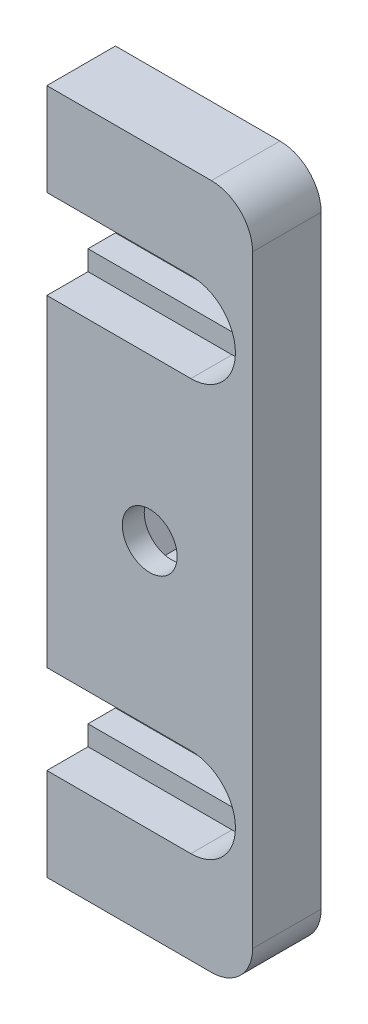
ISO-10303-21;
HEADER;
FILE_DESCRIPTION(('STEP AP214'),'2;1');
FILE_NAME('part.step','',(''),(''),'','','');
FILE_SCHEMA(('AUTOMOTIVE_DESIGN { 1 0 10303 214 1 1 1 1 }'));
ENDSEC;
DATA;
#1=APPLICATION_CONTEXT('core data for automotive mechanical design processes');
#2=APPLICATION_PROTOCOL_DEFINITION('international standard','automotive_design',2000,#1);
#3=PRODUCT_CONTEXT('',#1,'mechanical');
#4=PRODUCT('Part','Part','',(#3));
#5=PRODUCT_RELATED_PRODUCT_CATEGORY('part','',(#4));
#6=PRODUCT_DEFINITION_FORMATION('','',#4);
#7=PRODUCT_DEFINITION_CONTEXT('part definition',#1,'design');
#8=PRODUCT_DEFINITION('design','',#6,#7);
#9=PRODUCT_DEFINITION_SHAPE('','',#8);
#10=(LENGTH_UNIT() NAMED_UNIT(*) SI_UNIT(.MILLI.,.METRE.));
#11=(NAMED_UNIT(*) PLANE_ANGLE_UNIT() SI_UNIT($,.RADIAN.));
#12=(NAMED_UNIT(*) SI_UNIT($,.STERADIAN.) SOLID_ANGLE_UNIT());
#13=UNCERTAINTY_MEASURE_WITH_UNIT(LENGTH_MEASURE(1.E-05),#10,'distance_accuracy_value','');
#14=(GEOMETRIC_REPRESENTATION_CONTEXT(3) GLOBAL_UNCERTAINTY_ASSIGNED_CONTEXT((#13)) GLOBAL_UNIT_ASSIGNED_CONTEXT((#10,
#11,#12)) REPRESENTATION_CONTEXT('',''));
#15=CARTESIAN_POINT('',(0.,0.,0.));
#16=DIRECTION('',(0.,0.,1.));
#17=DIRECTION('',(1.,0.,0.));
#18=AXIS2_PLACEMENT_3D('',#15,#16,#17);
#19=CARTESIAN_POINT('',(7.5,25.,-0.00100000000000013));
#20=DIRECTION('',(0.,0.,1.));
#21=DIRECTION('',(1.,0.,0.));
#22=AXIS2_PLACEMENT_3D('',#19,#20,#21);
#23=CYLINDRICAL_SURFACE('',#22,2.);
#24=CARTESIAN_POINT('',(7.5,25.,5.));
#25=DIRECTION('',(0.,0.,1.));
#26=DIRECTION('',(1.,0.,0.));
#27=AXIS2_PLACEMENT_3D('',#24,#25,#26);
#28=CIRCLE('',#27,2.);
#29=CARTESIAN_POINT('',(9.49999999999999,25.,5.));
#30=VERTEX_POINT('',#29);
#31=EDGE_CURVE('E356',#30,#30,#28,.T.);
#32=ORIENTED_EDGE('',*,*,#31,.T.);
#33=EDGE_LOOP('',(#32));
#34=FACE_BOUND('',#33,.T.);
#35=CARTESIAN_POINT('',(7.5,25.,3.4));
#36=DIRECTION('',(0.,0.,-1.));
#37=DIRECTION('',(-1.,0.,0.));
#38=AXIS2_PLACEMENT_3D('',#35,#36,#37);
#39=CIRCLE('',#38,2.);
#40=CARTESIAN_POINT('',(5.5,25.,3.4));
#41=VERTEX_POINT('',#40);
#42=EDGE_CURVE('E41',#41,#41,#39,.F.);
#43=ORIENTED_EDGE('',*,*,#42,.F.);
#44=EDGE_LOOP('',(#43));
#45=FACE_BOUND('',#44,.T.);
#46=ADVANCED_FACE('F37',(#34,#45),#23,.F.);
#47=CARTESIAN_POINT('',(0.,0.,5.));
#48=DIRECTION('',(1.,0.,0.));
#49=DIRECTION('',(0.,1.,0.));
#50=AXIS2_PLACEMENT_3D('',#47,#48,#49);
#51=PLANE('',#50);
#52=DIRECTION('',(0.,0.,1.));
#53=VECTOR('',#52,1.);
#54=CARTESIAN_POINT('',(0.,38.2,-0.00100000000000013));
#55=LINE('',#54,#53);
#56=CARTESIAN_POINT('',(0.,38.2,0.));
#57=VERTEX_POINT('',#56);
#58=CARTESIAN_POINT('',(0.,38.2,2.));
#59=VERTEX_POINT('',#58);
#60=EDGE_CURVE('E294',#57,#59,#55,.T.);
#61=ORIENTED_EDGE('',*,*,#60,.F.);
#62=DIRECTION('',(0.,-1.,0.));
#63=VECTOR('',#62,1.);
#64=CARTESIAN_POINT('',(0.,0.,0.));
#65=LINE('',#64,#63);
#66=CARTESIAN_POINT('',(0.,11.8,0.));
#67=VERTEX_POINT('',#66);
#68=EDGE_CURVE('E411',#57,#67,#65,.T.);
#69=ORIENTED_EDGE('',*,*,#68,.T.);
#70=DIRECTION('',(0.,0.,1.));
#71=VECTOR('',#70,1.);
#72=CARTESIAN_POINT('',(0.,11.8,-0.00100000000000013));
#73=LINE('',#72,#71);
#74=CARTESIAN_POINT('',(0.,11.8,2.));
#75=VERTEX_POINT('',#74);
#76=EDGE_CURVE('E323',#67,#75,#73,.T.);
#77=ORIENTED_EDGE('',*,*,#76,.T.);
#78=DIRECTION('',(0.,-1.,0.));
#79=VECTOR('',#78,1.);
#80=CARTESIAN_POINT('',(0.,0.,2.));
#81=LINE('',#80,#79);
#82=CARTESIAN_POINT('',(0.,13.25,2.));
#83=VERTEX_POINT('',#82);
#84=EDGE_CURVE('E373',#83,#75,#81,.T.);
#85=ORIENTED_EDGE('',*,*,#84,.F.);
#86=DIRECTION('',(0.,0.,1.));
#87=VECTOR('',#86,1.);
#88=CARTESIAN_POINT('',(0.,13.25,2.));
#89=LINE('',#88,#87);
#90=CARTESIAN_POINT('',(0.,13.25,5.));
#91=VERTEX_POINT('',#90);
#92=EDGE_CURVE('E384',#83,#91,#89,.T.);
#93=ORIENTED_EDGE('',*,*,#92,.T.);
#94=DIRECTION('',(0.,-1.,0.));
#95=VECTOR('',#94,1.);
#96=CARTESIAN_POINT('',(0.,0.,5.));
#97=LINE('',#96,#95);
#98=CARTESIAN_POINT('',(0.,36.75,5.));
#99=VERTEX_POINT('',#98);
#100=EDGE_CURVE('E398',#99,#91,#97,.T.);
#101=ORIENTED_EDGE('',*,*,#100,.F.);
#102=DIRECTION('',(0.,0.,1.));
#103=VECTOR('',#102,1.);
#104=CARTESIAN_POINT('',(0.,36.75,2.));
#105=LINE('',#104,#103);
#106=CARTESIAN_POINT('',(0.,36.75,2.));
#107=VERTEX_POINT('',#106);
#108=EDGE_CURVE('E357',#107,#99,#105,.T.);
#109=ORIENTED_EDGE('',*,*,#108,.F.);
#110=DIRECTION('',(0.,-1.,0.));
#111=VECTOR('',#110,1.);
#112=CARTESIAN_POINT('',(0.,0.,2.));
#113=LINE('',#112,#111);
#114=EDGE_CURVE('E338',#59,#107,#113,.T.);
#115=ORIENTED_EDGE('',*,*,#114,.F.);
#116=EDGE_LOOP('',(#61,#69,#77,#85,#93,#101,#109,#115));
#117=FACE_BOUND('',#116,.T.);
#118=ADVANCED_FACE('F465',(#117),#51,.F.);
#119=DIRECTION('',(0.,0.,1.));
#120=VECTOR('',#119,1.);
#121=CARTESIAN_POINT('',(0.,41.8,-0.00100000000000013));
#122=LINE('',#121,#120);
#123=CARTESIAN_POINT('',(0.,41.8,0.));
#124=VERTEX_POINT('',#123);
#125=CARTESIAN_POINT('',(0.,41.8,2.));
#126=VERTEX_POINT('',#125);
#127=EDGE_CURVE('E297',#124,#126,#122,.T.);
#128=ORIENTED_EDGE('',*,*,#127,.T.);
#129=CARTESIAN_POINT('',(0.,43.25,2.));
#130=VERTEX_POINT('',#129);
#131=EDGE_CURVE('E339',#130,#126,#113,.T.);
#132=ORIENTED_EDGE('',*,*,#131,.F.);
#133=DIRECTION('',(0.,0.,1.));
#134=VECTOR('',#133,1.);
#135=CARTESIAN_POINT('',(0.,43.25,2.));
#136=LINE('',#135,#134);
#137=CARTESIAN_POINT('',(0.,43.25,5.));
#138=VERTEX_POINT('',#137);
#139=EDGE_CURVE('E359',#130,#138,#136,.T.);
#140=ORIENTED_EDGE('',*,*,#139,.T.);
#141=CARTESIAN_POINT('',(0.,50.,5.));
#142=VERTEX_POINT('',#141);
#143=EDGE_CURVE('E394',#142,#138,#97,.T.);
#144=ORIENTED_EDGE('',*,*,#143,.F.);
#145=DIRECTION('',(0.,0.,-1.));
#146=VECTOR('',#145,1.);
#147=CARTESIAN_POINT('',(0.,50.,5.));
#148=LINE('',#147,#146);
#149=CARTESIAN_POINT('',(0.,50.,0.));
#150=VERTEX_POINT('',#149);
#151=EDGE_CURVE('E406',#142,#150,#148,.T.);
#152=ORIENTED_EDGE('',*,*,#151,.T.);
#153=EDGE_CURVE('E407',#150,#124,#65,.T.);
#154=ORIENTED_EDGE('',*,*,#153,.T.);
#155=EDGE_LOOP('',(#128,#132,#140,#144,#152,#154));
#156=FACE_BOUND('',#155,.T.);
#157=ADVANCED_FACE('F513',(#156),#51,.F.);
#158=CARTESIAN_POINT('',(0.,8.20000000000001,2.));
#159=VERTEX_POINT('',#158);
#160=CARTESIAN_POINT('',(0.,6.75,2.));
#161=VERTEX_POINT('',#160);
#162=EDGE_CURVE('E372',#159,#161,#81,.T.);
#163=ORIENTED_EDGE('',*,*,#162,.F.);
#164=DIRECTION('',(0.,0.,1.));
#165=VECTOR('',#164,1.);
#166=CARTESIAN_POINT('',(0.,8.20000000000001,-0.00100000000000013));
#167=LINE('',#166,#165);
#168=CARTESIAN_POINT('',(0.,8.20000000000001,0.));
#169=VERTEX_POINT('',#168);
#170=EDGE_CURVE('E321',#169,#159,#167,.T.);
#171=ORIENTED_EDGE('',*,*,#170,.F.);
#172=CARTESIAN_POINT('',(0.,0.,0.));
#173=VERTEX_POINT('',#172);
#174=EDGE_CURVE('E393',#169,#173,#65,.T.);
#175=ORIENTED_EDGE('',*,*,#174,.T.);
#176=DIRECTION('',(0.,0.,-1.));
#177=VECTOR('',#176,1.);
#178=CARTESIAN_POINT('',(0.,0.,5.));
#179=LINE('',#178,#177);
#180=CARTESIAN_POINT('',(0.,0.,5.));
#181=VERTEX_POINT('',#180);
#182=EDGE_CURVE('E421',#181,#173,#179,.T.);
#183=ORIENTED_EDGE('',*,*,#182,.F.);
#184=CARTESIAN_POINT('',(0.,6.75,5.));
#185=VERTEX_POINT('',#184);
#186=EDGE_CURVE('E399',#185,#181,#97,.T.);
#187=ORIENTED_EDGE('',*,*,#186,.F.);
#188=DIRECTION('',(0.,0.,1.));
#189=VECTOR('',#188,1.);
#190=CARTESIAN_POINT('',(0.,6.75,2.));
#191=LINE('',#190,#189);
#192=EDGE_CURVE('E349',#161,#185,#191,.T.);
#193=ORIENTED_EDGE('',*,*,#192,.F.);
#194=EDGE_LOOP('',(#163,#171,#175,#183,#187,#193));
#195=FACE_BOUND('',#194,.T.);
#196=ADVANCED_FACE('F458',(#195),#51,.F.);
#197=CARTESIAN_POINT('',(0.,0.,0.));
#198=DIRECTION('',(0.,0.,-1.));
#199=DIRECTION('',(-1.,0.,0.));
#200=AXIS2_PLACEMENT_3D('',#197,#198,#199);
#201=PLANE('',#200);
#202=DIRECTION('',(-0.499999999999999,0.866025403784439,0.));
#203=VECTOR('',#202,1.);
#204=CARTESIAN_POINT('',(5.47927405783631,21.5,0.));
#205=LINE('',#204,#203);
#206=CARTESIAN_POINT('',(5.47927405783631,21.5,0.));
#207=VERTEX_POINT('',#206);
#208=CARTESIAN_POINT('',(3.45854811567261,25.,0.));
#209=VERTEX_POINT('',#208);
#210=EDGE_CURVE('E53',#207,#209,#205,.T.);
#211=ORIENTED_EDGE('',*,*,#210,.F.);
#212=DIRECTION('',(-1.,0.,0.));
#213=VECTOR('',#212,1.);
#214=CARTESIAN_POINT('',(9.52072594216367,21.5,0.));
#215=LINE('',#214,#213);
#216=CARTESIAN_POINT('',(9.52072594216367,21.5,0.));
#217=VERTEX_POINT('',#216);
#218=EDGE_CURVE('E246',#217,#207,#215,.T.);
#219=ORIENTED_EDGE('',*,*,#218,.F.);
#220=DIRECTION('',(-0.500000000000001,-0.866025403784438,0.));
#221=VECTOR('',#220,1.);
#222=CARTESIAN_POINT('',(11.5414518843274,25.,0.));
#223=LINE('',#222,#221);
#224=CARTESIAN_POINT('',(11.5414518843274,25.,0.));
#225=VERTEX_POINT('',#224);
#226=EDGE_CURVE('E249',#225,#217,#223,.T.);
#227=ORIENTED_EDGE('',*,*,#226,.F.);
#228=DIRECTION('',(0.5,-0.866025403784439,0.));
#229=VECTOR('',#228,1.);
#230=CARTESIAN_POINT('',(9.52072594216368,28.5,0.));
#231=LINE('',#230,#229);
#232=CARTESIAN_POINT('',(9.52072594216368,28.5,0.));
#233=VERTEX_POINT('',#232);
#234=EDGE_CURVE('E265',#233,#225,#231,.T.);
#235=ORIENTED_EDGE('',*,*,#234,.F.);
#236=DIRECTION('',(1.,0.,0.));
#237=VECTOR('',#236,1.);
#238=CARTESIAN_POINT('',(5.47927405783631,28.5,0.));
#239=LINE('',#238,#237);
#240=CARTESIAN_POINT('',(5.47927405783631,28.5,0.));
#241=VERTEX_POINT('',#240);
#242=EDGE_CURVE('E262',#241,#233,#239,.T.);
#243=ORIENTED_EDGE('',*,*,#242,.F.);
#244=DIRECTION('',(0.5,0.866025403784438,0.));
#245=VECTOR('',#244,1.);
#246=CARTESIAN_POINT('',(3.45854811567262,25.,0.));
#247=LINE('',#246,#245);
#248=EDGE_CURVE('E260',#209,#241,#247,.T.);
#249=ORIENTED_EDGE('',*,*,#248,.F.);
#250=EDGE_LOOP('',(#211,#219,#227,#235,#243,#249));
#251=FACE_BOUND('',#250,.T.);
#252=DIRECTION('',(0.,1.,0.));
#253=VECTOR('',#252,1.);
#254=CARTESIAN_POINT('',(15.,0.,0.));
#255=LINE('',#254,#253);
#256=CARTESIAN_POINT('',(15.,3.,0.));
#257=VERTEX_POINT('',#256);
#258=CARTESIAN_POINT('',(15.,47.,0.));
#259=VERTEX_POINT('',#258);
#260=EDGE_CURVE('E414',#257,#259,#255,.T.);
#261=ORIENTED_EDGE('',*,*,#260,.F.);
#262=CARTESIAN_POINT('',(12.,3.,0.));
#263=DIRECTION('',(0.,0.,-1.));
#264=DIRECTION('',(-1.,0.,0.));
#265=AXIS2_PLACEMENT_3D('',#262,#263,#264);
#266=CIRCLE('',#265,3.);
#267=CARTESIAN_POINT('',(12.,0.,0.));
#268=VERTEX_POINT('',#267);
#269=EDGE_CURVE('E431',#257,#268,#266,.T.);
#270=ORIENTED_EDGE('',*,*,#269,.T.);
#271=DIRECTION('',(1.,0.,0.));
#272=VECTOR('',#271,1.);
#273=CARTESIAN_POINT('',(0.,0.,0.));
#274=LINE('',#273,#272);
#275=EDGE_CURVE('E410',#173,#268,#274,.T.);
#276=ORIENTED_EDGE('',*,*,#275,.F.);
#277=ORIENTED_EDGE('',*,*,#174,.F.);
#278=DIRECTION('',(1.,0.,0.));
#279=VECTOR('',#278,1.);
#280=CARTESIAN_POINT('',(0.,8.20000000000001,0.));
#281=LINE('',#280,#279);
#282=CARTESIAN_POINT('',(10.5,8.2,0.));
#283=VERTEX_POINT('',#282);
#284=EDGE_CURVE('E310',#169,#283,#281,.T.);
#285=ORIENTED_EDGE('',*,*,#284,.T.);
#286=CARTESIAN_POINT('',(10.5,10.,0.));
#287=DIRECTION('',(0.,0.,-1.));
#288=DIRECTION('',(-1.,0.,0.));
#289=AXIS2_PLACEMENT_3D('',#286,#287,#288);
#290=CIRCLE('',#289,1.8);
#291=CARTESIAN_POINT('',(10.5,11.8,0.));
#292=VERTEX_POINT('',#291);
#293=EDGE_CURVE('E282',#292,#283,#290,.T.);
#294=ORIENTED_EDGE('',*,*,#293,.F.);
#295=DIRECTION('',(-1.,0.,0.));
#296=VECTOR('',#295,1.);
#297=CARTESIAN_POINT('',(0.,11.8,0.));
#298=LINE('',#297,#296);
#299=EDGE_CURVE('E307',#292,#67,#298,.T.);
#300=ORIENTED_EDGE('',*,*,#299,.T.);
#301=ORIENTED_EDGE('',*,*,#68,.F.);
#302=DIRECTION('',(-1.,0.,0.));
#303=VECTOR('',#302,1.);
#304=CARTESIAN_POINT('',(0.,38.2,0.));
#305=LINE('',#304,#303);
#306=CARTESIAN_POINT('',(10.5,38.2,0.));
#307=VERTEX_POINT('',#306);
#308=EDGE_CURVE('E281',#307,#57,#305,.T.);
#309=ORIENTED_EDGE('',*,*,#308,.F.);
#310=CARTESIAN_POINT('',(10.5,40.,0.));
#311=DIRECTION('',(0.,0.,-1.));
#312=DIRECTION('',(-1.,0.,0.));
#313=AXIS2_PLACEMENT_3D('',#310,#311,#312);
#314=CIRCLE('',#313,1.8);
#315=CARTESIAN_POINT('',(10.5,41.8,0.));
#316=VERTEX_POINT('',#315);
#317=EDGE_CURVE('E296',#307,#316,#314,.F.);
#318=ORIENTED_EDGE('',*,*,#317,.T.);
#319=DIRECTION('',(1.,0.,0.));
#320=VECTOR('',#319,1.);
#321=CARTESIAN_POINT('',(0.,41.8,0.));
#322=LINE('',#321,#320);
#323=EDGE_CURVE('E279',#124,#316,#322,.T.);
#324=ORIENTED_EDGE('',*,*,#323,.F.);
#325=ORIENTED_EDGE('',*,*,#153,.F.);
#326=DIRECTION('',(-1.,0.,0.));
#327=VECTOR('',#326,1.);
#328=CARTESIAN_POINT('',(0.,50.,0.));
#329=LINE('',#328,#327);
#330=CARTESIAN_POINT('',(12.,50.,0.));
#331=VERTEX_POINT('',#330);
#332=EDGE_CURVE('E417',#331,#150,#329,.T.);
#333=ORIENTED_EDGE('',*,*,#332,.F.);
#334=CARTESIAN_POINT('',(12.,47.,0.));
#335=DIRECTION('',(0.,0.,-1.));
#336=DIRECTION('',(-1.,0.,0.));
#337=AXIS2_PLACEMENT_3D('',#334,#335,#336);
#338=CIRCLE('',#337,3.);
#339=EDGE_CURVE('E429',#331,#259,#338,.T.);
#340=ORIENTED_EDGE('',*,*,#339,.T.);
#341=EDGE_LOOP('',(#261,#270,#276,#277,#285,#294,#300,#301,#309,#318,#324,#325,#333,#340));
#342=FACE_BOUND('',#341,.T.);
#343=ADVANCED_FACE('F450',(#251,#342),#201,.T.);
#344=CARTESIAN_POINT('',(0.,0.,2.));
#345=DIRECTION('',(0.,0.,1.));
#346=DIRECTION('',(1.,0.,0.));
#347=AXIS2_PLACEMENT_3D('',#344,#345,#346);
#348=PLANE('',#347);
#349=DIRECTION('',(1.,0.,0.));
#350=VECTOR('',#349,1.);
#351=CARTESIAN_POINT('',(0.,8.20000000000001,2.));
#352=LINE('',#351,#350);
#353=CARTESIAN_POINT('',(10.5,8.2,2.));
#354=VERTEX_POINT('',#353);
#355=EDGE_CURVE('E313',#159,#354,#352,.T.);
#356=ORIENTED_EDGE('',*,*,#355,.F.);
#357=ORIENTED_EDGE('',*,*,#162,.T.);
#358=DIRECTION('',(1.,0.,0.));
#359=VECTOR('',#358,1.);
#360=CARTESIAN_POINT('',(0.,6.75,2.));
#361=LINE('',#360,#359);
#362=CARTESIAN_POINT('',(10.5,6.75,2.));
#363=VERTEX_POINT('',#362);
#364=EDGE_CURVE('E364',#161,#363,#361,.T.);
#365=ORIENTED_EDGE('',*,*,#364,.T.);
#366=CARTESIAN_POINT('',(10.5,10.,2.));
#367=DIRECTION('',(0.,0.,1.));
#368=DIRECTION('',(1.,0.,0.));
#369=AXIS2_PLACEMENT_3D('',#366,#367,#368);
#370=CIRCLE('',#369,3.25);
#371=CARTESIAN_POINT('',(10.5,13.25,2.));
#372=VERTEX_POINT('',#371);
#373=EDGE_CURVE('E367',#372,#363,#370,.F.);
#374=ORIENTED_EDGE('',*,*,#373,.F.);
#375=DIRECTION('',(1.,0.,0.));
#376=VECTOR('',#375,1.);
#377=CARTESIAN_POINT('',(0.,13.25,2.));
#378=LINE('',#377,#376);
#379=EDGE_CURVE('E370',#83,#372,#378,.T.);
#380=ORIENTED_EDGE('',*,*,#379,.F.);
#381=ORIENTED_EDGE('',*,*,#84,.T.);
#382=DIRECTION('',(-1.,0.,0.));
#383=VECTOR('',#382,1.);
#384=CARTESIAN_POINT('',(0.,11.8,2.));
#385=LINE('',#384,#383);
#386=CARTESIAN_POINT('',(10.5,11.8,2.));
#387=VERTEX_POINT('',#386);
#388=EDGE_CURVE('E318',#387,#75,#385,.T.);
#389=ORIENTED_EDGE('',*,*,#388,.F.);
#390=CARTESIAN_POINT('',(10.5,10.,2.));
#391=DIRECTION('',(0.,0.,1.));
#392=DIRECTION('',(1.,0.,0.));
#393=AXIS2_PLACEMENT_3D('',#390,#391,#392);
#394=CIRCLE('',#393,1.8);
#395=EDGE_CURVE('E315',#387,#354,#394,.F.);
#396=ORIENTED_EDGE('',*,*,#395,.T.);
#397=EDGE_LOOP('',(#356,#357,#365,#374,#380,#381,#389,#396));
#398=FACE_BOUND('',#397,.T.);
#399=ADVANCED_FACE('F477',(#398),#348,.T.);
#400=CARTESIAN_POINT('',(0.,0.,2.));
#401=DIRECTION('',(0.,0.,1.));
#402=DIRECTION('',(1.,0.,0.));
#403=AXIS2_PLACEMENT_3D('',#400,#401,#402);
#404=PLANE('',#403);
#405=CARTESIAN_POINT('',(10.5,40.,2.));
#406=DIRECTION('',(0.,0.,1.));
#407=DIRECTION('',(1.,0.,0.));
#408=AXIS2_PLACEMENT_3D('',#405,#406,#407);
#409=CIRCLE('',#408,1.8);
#410=CARTESIAN_POINT('',(10.5,38.2,2.));
#411=VERTEX_POINT('',#410);
#412=CARTESIAN_POINT('',(10.5,41.8,2.));
#413=VERTEX_POINT('',#412);
#414=EDGE_CURVE('E287',#411,#413,#409,.T.);
#415=ORIENTED_EDGE('',*,*,#414,.F.);
#416=DIRECTION('',(-1.,0.,0.));
#417=VECTOR('',#416,1.);
#418=CARTESIAN_POINT('',(0.,38.2,2.));
#419=LINE('',#418,#417);
#420=EDGE_CURVE('E284',#411,#59,#419,.T.);
#421=ORIENTED_EDGE('',*,*,#420,.T.);
#422=ORIENTED_EDGE('',*,*,#114,.T.);
#423=DIRECTION('',(1.,0.,0.));
#424=VECTOR('',#423,1.);
#425=CARTESIAN_POINT('',(0.,36.75,2.));
#426=LINE('',#425,#424);
#427=CARTESIAN_POINT('',(10.5,36.75,2.));
#428=VERTEX_POINT('',#427);
#429=EDGE_CURVE('E342',#107,#428,#426,.T.);
#430=ORIENTED_EDGE('',*,*,#429,.T.);
#431=CARTESIAN_POINT('',(10.5,40.,2.));
#432=DIRECTION('',(0.,0.,1.));
#433=DIRECTION('',(1.,0.,0.));
#434=AXIS2_PLACEMENT_3D('',#431,#432,#433);
#435=CIRCLE('',#434,3.25);
#436=CARTESIAN_POINT('',(10.5,43.25,2.));
#437=VERTEX_POINT('',#436);
#438=EDGE_CURVE('E332',#428,#437,#435,.T.);
#439=ORIENTED_EDGE('',*,*,#438,.T.);
#440=DIRECTION('',(1.,0.,0.));
#441=VECTOR('',#440,1.);
#442=CARTESIAN_POINT('',(0.,43.25,2.));
#443=LINE('',#442,#441);
#444=EDGE_CURVE('E335',#130,#437,#443,.T.);
#445=ORIENTED_EDGE('',*,*,#444,.F.);
#446=ORIENTED_EDGE('',*,*,#131,.T.);
#447=DIRECTION('',(1.,0.,0.));
#448=VECTOR('',#447,1.);
#449=CARTESIAN_POINT('',(0.,41.8,2.));
#450=LINE('',#449,#448);
#451=EDGE_CURVE('E290',#126,#413,#450,.T.);
#452=ORIENTED_EDGE('',*,*,#451,.T.);
#453=EDGE_LOOP('',(#415,#421,#422,#430,#439,#445,#446,#452));
#454=FACE_BOUND('',#453,.T.);
#455=ADVANCED_FACE('F521',(#454),#404,.T.);
#456=CARTESIAN_POINT('',(0.,0.,5.));
#457=DIRECTION('',(0.,0.,-1.));
#458=DIRECTION('',(-1.,0.,0.));
#459=AXIS2_PLACEMENT_3D('',#456,#457,#458);
#460=PLANE('',#459);
#461=ORIENTED_EDGE('',*,*,#31,.F.);
#462=EDGE_LOOP('',(#461));
#463=FACE_BOUND('',#462,.T.);
#464=DIRECTION('',(1.,0.,0.));
#465=VECTOR('',#464,1.);
#466=CARTESIAN_POINT('',(0.,0.,5.));
#467=LINE('',#466,#465);
#468=CARTESIAN_POINT('',(12.,0.,5.));
#469=VERTEX_POINT('',#468);
#470=EDGE_CURVE('E397',#181,#469,#467,.T.);
#471=ORIENTED_EDGE('',*,*,#470,.T.);
#472=CARTESIAN_POINT('',(12.,3.,5.));
#473=DIRECTION('',(0.,0.,-1.));
#474=DIRECTION('',(-1.,0.,0.));
#475=AXIS2_PLACEMENT_3D('',#472,#473,#474);
#476=CIRCLE('',#475,3.);
#477=CARTESIAN_POINT('',(15.,3.,5.));
#478=VERTEX_POINT('',#477);
#479=EDGE_CURVE('E46',#469,#478,#476,.F.);
#480=ORIENTED_EDGE('',*,*,#479,.T.);
#481=DIRECTION('',(0.,1.,0.));
#482=VECTOR('',#481,1.);
#483=CARTESIAN_POINT('',(15.,0.,5.));
#484=LINE('',#483,#482);
#485=CARTESIAN_POINT('',(15.,47.,5.));
#486=VERTEX_POINT('',#485);
#487=EDGE_CURVE('E402',#478,#486,#484,.T.);
#488=ORIENTED_EDGE('',*,*,#487,.T.);
#489=CARTESIAN_POINT('',(12.,47.,5.));
#490=DIRECTION('',(0.,0.,-1.));
#491=DIRECTION('',(-1.,0.,0.));
#492=AXIS2_PLACEMENT_3D('',#489,#490,#491);
#493=CIRCLE('',#492,3.);
#494=CARTESIAN_POINT('',(12.,50.,5.));
#495=VERTEX_POINT('',#494);
#496=EDGE_CURVE('E61',#486,#495,#493,.F.);
#497=ORIENTED_EDGE('',*,*,#496,.T.);
#498=DIRECTION('',(-1.,0.,0.));
#499=VECTOR('',#498,1.);
#500=CARTESIAN_POINT('',(0.,50.,5.));
#501=LINE('',#500,#499);
#502=EDGE_CURVE('E404',#495,#142,#501,.T.);
#503=ORIENTED_EDGE('',*,*,#502,.T.);
#504=ORIENTED_EDGE('',*,*,#143,.T.);
#505=DIRECTION('',(1.,0.,0.));
#506=VECTOR('',#505,1.);
#507=CARTESIAN_POINT('',(0.,43.25,5.));
#508=LINE('',#507,#506);
#509=CARTESIAN_POINT('',(10.5,43.25,5.));
#510=VERTEX_POINT('',#509);
#511=EDGE_CURVE('E348',#138,#510,#508,.T.);
#512=ORIENTED_EDGE('',*,*,#511,.T.);
#513=CARTESIAN_POINT('',(10.5,40.,5.));
#514=DIRECTION('',(0.,0.,1.));
#515=DIRECTION('',(1.,0.,0.));
#516=AXIS2_PLACEMENT_3D('',#513,#514,#515);
#517=CIRCLE('',#516,3.25);
#518=CARTESIAN_POINT('',(10.5,36.75,5.));
#519=VERTEX_POINT('',#518);
#520=EDGE_CURVE('E346',#519,#510,#517,.T.);
#521=ORIENTED_EDGE('',*,*,#520,.F.);
#522=DIRECTION('',(1.,0.,0.));
#523=VECTOR('',#522,1.);
#524=CARTESIAN_POINT('',(0.,36.75,5.));
#525=LINE('',#524,#523);
#526=EDGE_CURVE('E336',#99,#519,#525,.T.);
#527=ORIENTED_EDGE('',*,*,#526,.F.);
#528=ORIENTED_EDGE('',*,*,#100,.T.);
#529=DIRECTION('',(1.,0.,0.));
#530=VECTOR('',#529,1.);
#531=CARTESIAN_POINT('',(0.,13.25,5.));
#532=LINE('',#531,#530);
#533=CARTESIAN_POINT('',(10.5,13.25,5.));
#534=VERTEX_POINT('',#533);
#535=EDGE_CURVE('E368',#91,#534,#532,.T.);
#536=ORIENTED_EDGE('',*,*,#535,.T.);
#537=CARTESIAN_POINT('',(10.5,10.,5.));
#538=DIRECTION('',(0.,0.,1.));
#539=DIRECTION('',(1.,0.,0.));
#540=AXIS2_PLACEMENT_3D('',#537,#538,#539);
#541=CIRCLE('',#540,3.25);
#542=CARTESIAN_POINT('',(10.5,6.75,5.));
#543=VERTEX_POINT('',#542);
#544=EDGE_CURVE('E378',#534,#543,#541,.F.);
#545=ORIENTED_EDGE('',*,*,#544,.T.);
#546=DIRECTION('',(1.,0.,0.));
#547=VECTOR('',#546,1.);
#548=CARTESIAN_POINT('',(0.,6.75,5.));
#549=LINE('',#548,#547);
#550=EDGE_CURVE('E306',#185,#543,#549,.T.);
#551=ORIENTED_EDGE('',*,*,#550,.F.);
#552=ORIENTED_EDGE('',*,*,#186,.T.);
#553=EDGE_LOOP('',(#471,#480,#488,#497,#503,#504,#512,#521,#527,#528,#536,#545,#551,#552));
#554=FACE_BOUND('',#553,.T.);
#555=ADVANCED_FACE('F438',(#463,#554),#460,.F.);
#556=CARTESIAN_POINT('',(0.,0.,5.));
#557=DIRECTION('',(0.,1.,0.));
#558=DIRECTION('',(0.,0.,1.));
#559=AXIS2_PLACEMENT_3D('',#556,#557,#558);
#560=PLANE('',#559);
#561=ORIENTED_EDGE('',*,*,#275,.T.);
#562=DIRECTION('',(0.,0.,-1.));
#563=VECTOR('',#562,1.);
#564=CARTESIAN_POINT('',(12.,0.,5.));
#565=LINE('',#564,#563);
#566=EDGE_CURVE('E433',#268,#469,#565,.F.);
#567=ORIENTED_EDGE('',*,*,#566,.T.);
#568=ORIENTED_EDGE('',*,*,#470,.F.);
#569=ORIENTED_EDGE('',*,*,#182,.T.);
#570=EDGE_LOOP('',(#561,#567,#568,#569));
#571=FACE_BOUND('',#570,.T.);
#572=ADVANCED_FACE('F453',(#571),#560,.F.);
#573=CARTESIAN_POINT('',(15.,0.,5.));
#574=DIRECTION('',(-1.,0.,0.));
#575=DIRECTION('',(0.,-1.,0.));
#576=AXIS2_PLACEMENT_3D('',#573,#574,#575);
#577=PLANE('',#576);
#578=ORIENTED_EDGE('',*,*,#487,.F.);
#579=DIRECTION('',(0.,0.,-1.));
#580=VECTOR('',#579,1.);
#581=CARTESIAN_POINT('',(15.,3.,5.));
#582=LINE('',#581,#580);
#583=EDGE_CURVE('E426',#478,#257,#582,.T.);
#584=ORIENTED_EDGE('',*,*,#583,.T.);
#585=ORIENTED_EDGE('',*,*,#260,.T.);
#586=DIRECTION('',(0.,0.,-1.));
#587=VECTOR('',#586,1.);
#588=CARTESIAN_POINT('',(15.,47.,5.));
#589=LINE('',#588,#587);
#590=EDGE_CURVE('E424',#259,#486,#589,.F.);
#591=ORIENTED_EDGE('',*,*,#590,.T.);
#592=EDGE_LOOP('',(#578,#584,#585,#591));
#593=FACE_BOUND('',#592,.T.);
#594=ADVANCED_FACE('F444',(#593),#577,.F.);
#595=CARTESIAN_POINT('',(0.,50.,5.));
#596=DIRECTION('',(0.,-1.,0.));
#597=DIRECTION('',(0.,0.,-1.));
#598=AXIS2_PLACEMENT_3D('',#595,#596,#597);
#599=PLANE('',#598);
#600=ORIENTED_EDGE('',*,*,#502,.F.);
#601=DIRECTION('',(0.,0.,-1.));
#602=VECTOR('',#601,1.);
#603=CARTESIAN_POINT('',(12.,50.,5.));
#604=LINE('',#603,#602);
#605=EDGE_CURVE('E11',#495,#331,#604,.T.);
#606=ORIENTED_EDGE('',*,*,#605,.T.);
#607=ORIENTED_EDGE('',*,*,#332,.T.);
#608=ORIENTED_EDGE('',*,*,#151,.F.);
#609=EDGE_LOOP('',(#600,#606,#607,#608));
#610=FACE_BOUND('',#609,.T.);
#611=ADVANCED_FACE('F526',(#610),#599,.F.);
#612=CARTESIAN_POINT('',(0.,6.75,2.));
#613=DIRECTION('',(0.,-1.,0.));
#614=DIRECTION('',(0.,0.,-1.));
#615=AXIS2_PLACEMENT_3D('',#612,#613,#614);
#616=PLANE('',#615);
#617=ORIENTED_EDGE('',*,*,#550,.T.);
#618=DIRECTION('',(0.,0.,1.));
#619=VECTOR('',#618,1.);
#620=CARTESIAN_POINT('',(10.5,6.75,2.));
#621=LINE('',#620,#619);
#622=EDGE_CURVE('E376',#363,#543,#621,.T.);
#623=ORIENTED_EDGE('',*,*,#622,.F.);
#624=ORIENTED_EDGE('',*,*,#364,.F.);
#625=ORIENTED_EDGE('',*,*,#192,.T.);
#626=EDGE_LOOP('',(#617,#623,#624,#625));
#627=FACE_BOUND('',#626,.T.);
#628=ADVANCED_FACE('F490',(#627),#616,.F.);
#629=CARTESIAN_POINT('',(0.,13.25,2.));
#630=DIRECTION('',(0.,-1.,0.));
#631=DIRECTION('',(1.,0.,0.));
#632=AXIS2_PLACEMENT_3D('',#629,#630,#631);
#633=PLANE('',#632);
#634=ORIENTED_EDGE('',*,*,#535,.F.);
#635=ORIENTED_EDGE('',*,*,#92,.F.);
#636=ORIENTED_EDGE('',*,*,#379,.T.);
#637=DIRECTION('',(0.,0.,1.));
#638=VECTOR('',#637,1.);
#639=CARTESIAN_POINT('',(10.5,13.25,2.));
#640=LINE('',#639,#638);
#641=EDGE_CURVE('E387',#372,#534,#640,.T.);
#642=ORIENTED_EDGE('',*,*,#641,.T.);
#643=EDGE_LOOP('',(#634,#635,#636,#642));
#644=FACE_BOUND('',#643,.T.);
#645=ADVANCED_FACE('F553',(#644),#633,.T.);
#646=CARTESIAN_POINT('',(10.5,10.,2.));
#647=DIRECTION('',(0.,0.,1.));
#648=DIRECTION('',(1.,0.,0.));
#649=AXIS2_PLACEMENT_3D('',#646,#647,#648);
#650=CYLINDRICAL_SURFACE('',#649,3.25);
#651=ORIENTED_EDGE('',*,*,#544,.F.);
#652=ORIENTED_EDGE('',*,*,#641,.F.);
#653=ORIENTED_EDGE('',*,*,#373,.T.);
#654=ORIENTED_EDGE('',*,*,#622,.T.);
#655=EDGE_LOOP('',(#651,#652,#653,#654));
#656=FACE_BOUND('',#655,.T.);
#657=ADVANCED_FACE('F493',(#656),#650,.F.);
#658=CARTESIAN_POINT('',(10.5,40.,2.));
#659=DIRECTION('',(0.,0.,1.));
#660=DIRECTION('',(1.,0.,0.));
#661=AXIS2_PLACEMENT_3D('',#658,#659,#660);
#662=CYLINDRICAL_SURFACE('',#661,3.25);
#663=ORIENTED_EDGE('',*,*,#520,.T.);
#664=DIRECTION('',(0.,0.,1.));
#665=VECTOR('',#664,1.);
#666=CARTESIAN_POINT('',(10.5,43.25,2.));
#667=LINE('',#666,#665);
#668=EDGE_CURVE('E345',#437,#510,#667,.T.);
#669=ORIENTED_EDGE('',*,*,#668,.F.);
#670=ORIENTED_EDGE('',*,*,#438,.F.);
#671=DIRECTION('',(0.,0.,1.));
#672=VECTOR('',#671,1.);
#673=CARTESIAN_POINT('',(10.5,36.75,2.));
#674=LINE('',#673,#672);
#675=EDGE_CURVE('E354',#428,#519,#674,.T.);
#676=ORIENTED_EDGE('',*,*,#675,.T.);
#677=EDGE_LOOP('',(#663,#669,#670,#676));
#678=FACE_BOUND('',#677,.T.);
#679=ADVANCED_FACE('F565',(#678),#662,.F.);
#680=CARTESIAN_POINT('',(0.,36.75,2.));
#681=DIRECTION('',(0.,-1.,0.));
#682=DIRECTION('',(1.,0.,0.));
#683=AXIS2_PLACEMENT_3D('',#680,#681,#682);
#684=PLANE('',#683);
#685=ORIENTED_EDGE('',*,*,#526,.T.);
#686=ORIENTED_EDGE('',*,*,#675,.F.);
#687=ORIENTED_EDGE('',*,*,#429,.F.);
#688=ORIENTED_EDGE('',*,*,#108,.T.);
#689=EDGE_LOOP('',(#685,#686,#687,#688));
#690=FACE_BOUND('',#689,.T.);
#691=ADVANCED_FACE('F571',(#690),#684,.F.);
#692=CARTESIAN_POINT('',(0.,43.25,2.));
#693=DIRECTION('',(0.,-1.,0.));
#694=DIRECTION('',(0.,0.,-1.));
#695=AXIS2_PLACEMENT_3D('',#692,#693,#694);
#696=PLANE('',#695);
#697=ORIENTED_EDGE('',*,*,#511,.F.);
#698=ORIENTED_EDGE('',*,*,#139,.F.);
#699=ORIENTED_EDGE('',*,*,#444,.T.);
#700=ORIENTED_EDGE('',*,*,#668,.T.);
#701=EDGE_LOOP('',(#697,#698,#699,#700));
#702=FACE_BOUND('',#701,.T.);
#703=ADVANCED_FACE('F579',(#702),#696,.T.);
#704=CARTESIAN_POINT('',(0.,38.2,-0.00100000000000013));
#705=DIRECTION('',(0.,1.,0.));
#706=DIRECTION('',(0.,0.,1.));
#707=AXIS2_PLACEMENT_3D('',#704,#705,#706);
#708=PLANE('',#707);
#709=ORIENTED_EDGE('',*,*,#308,.T.);
#710=ORIENTED_EDGE('',*,*,#60,.T.);
#711=ORIENTED_EDGE('',*,*,#420,.F.);
#712=DIRECTION('',(0.,0.,1.));
#713=VECTOR('',#712,1.);
#714=CARTESIAN_POINT('',(10.5,38.2,-0.00100000000000013));
#715=LINE('',#714,#713);
#716=EDGE_CURVE('E293',#307,#411,#715,.T.);
#717=ORIENTED_EDGE('',*,*,#716,.F.);
#718=EDGE_LOOP('',(#709,#710,#711,#717));
#719=FACE_BOUND('',#718,.T.);
#720=ADVANCED_FACE('F587',(#719),#708,.T.);
#721=CARTESIAN_POINT('',(0.,41.8,-0.00100000000000013));
#722=DIRECTION('',(0.,-1.,0.));
#723=DIRECTION('',(0.,0.,-1.));
#724=AXIS2_PLACEMENT_3D('',#721,#722,#723);
#725=PLANE('',#724);
#726=ORIENTED_EDGE('',*,*,#323,.T.);
#727=DIRECTION('',(0.,0.,1.));
#728=VECTOR('',#727,1.);
#729=CARTESIAN_POINT('',(10.5,41.8,-0.00100000000000013));
#730=LINE('',#729,#728);
#731=EDGE_CURVE('E300',#316,#413,#730,.T.);
#732=ORIENTED_EDGE('',*,*,#731,.T.);
#733=ORIENTED_EDGE('',*,*,#451,.F.);
#734=ORIENTED_EDGE('',*,*,#127,.F.);
#735=EDGE_LOOP('',(#726,#732,#733,#734));
#736=FACE_BOUND('',#735,.T.);
#737=ADVANCED_FACE('F596',(#736),#725,.T.);
#738=CARTESIAN_POINT('',(10.5,40.,-0.00100000000000013));
#739=DIRECTION('',(0.,0.,1.));
#740=DIRECTION('',(1.,0.,0.));
#741=AXIS2_PLACEMENT_3D('',#738,#739,#740);
#742=CYLINDRICAL_SURFACE('',#741,1.8);
#743=ORIENTED_EDGE('',*,*,#716,.T.);
#744=ORIENTED_EDGE('',*,*,#414,.T.);
#745=ORIENTED_EDGE('',*,*,#731,.F.);
#746=ORIENTED_EDGE('',*,*,#317,.F.);
#747=EDGE_LOOP('',(#743,#744,#745,#746));
#748=FACE_BOUND('',#747,.T.);
#749=ADVANCED_FACE('F605',(#748),#742,.F.);
#750=CARTESIAN_POINT('',(0.,8.20000000000001,-0.00100000000000013));
#751=DIRECTION('',(0.,-1.,0.));
#752=DIRECTION('',(0.,0.,-1.));
#753=AXIS2_PLACEMENT_3D('',#750,#751,#752);
#754=PLANE('',#753);
#755=ORIENTED_EDGE('',*,*,#170,.T.);
#756=ORIENTED_EDGE('',*,*,#355,.T.);
#757=DIRECTION('',(0.,0.,1.));
#758=VECTOR('',#757,1.);
#759=CARTESIAN_POINT('',(10.5,8.2,-0.00100000000000013));
#760=LINE('',#759,#758);
#761=EDGE_CURVE('E320',#283,#354,#760,.T.);
#762=ORIENTED_EDGE('',*,*,#761,.F.);
#763=ORIENTED_EDGE('',*,*,#284,.F.);
#764=EDGE_LOOP('',(#755,#756,#762,#763));
#765=FACE_BOUND('',#764,.T.);
#766=ADVANCED_FACE('F496',(#765),#754,.F.);
#767=CARTESIAN_POINT('',(0.,11.8,-0.00100000000000013));
#768=DIRECTION('',(0.,1.,0.));
#769=DIRECTION('',(0.,0.,1.));
#770=AXIS2_PLACEMENT_3D('',#767,#768,#769);
#771=PLANE('',#770);
#772=DIRECTION('',(0.,0.,1.));
#773=VECTOR('',#772,1.);
#774=CARTESIAN_POINT('',(10.5,11.8,-0.00100000000000013));
#775=LINE('',#774,#773);
#776=EDGE_CURVE('E326',#292,#387,#775,.T.);
#777=ORIENTED_EDGE('',*,*,#776,.T.);
#778=ORIENTED_EDGE('',*,*,#388,.T.);
#779=ORIENTED_EDGE('',*,*,#76,.F.);
#780=ORIENTED_EDGE('',*,*,#299,.F.);
#781=EDGE_LOOP('',(#777,#778,#779,#780));
#782=FACE_BOUND('',#781,.T.);
#783=ADVANCED_FACE('F472',(#782),#771,.F.);
#784=CARTESIAN_POINT('',(10.5,10.,-0.00100000000000013));
#785=DIRECTION('',(0.,0.,1.));
#786=DIRECTION('',(1.,0.,0.));
#787=AXIS2_PLACEMENT_3D('',#784,#785,#786);
#788=CYLINDRICAL_SURFACE('',#787,1.8);
#789=ORIENTED_EDGE('',*,*,#293,.T.);
#790=ORIENTED_EDGE('',*,*,#761,.T.);
#791=ORIENTED_EDGE('',*,*,#395,.F.);
#792=ORIENTED_EDGE('',*,*,#776,.F.);
#793=EDGE_LOOP('',(#789,#790,#791,#792));
#794=FACE_BOUND('',#793,.T.);
#795=ADVANCED_FACE('F498',(#794),#788,.F.);
#796=CARTESIAN_POINT('',(12.,3.,5.));
#797=DIRECTION('',(0.,0.,-1.));
#798=DIRECTION('',(-1.,0.,0.));
#799=AXIS2_PLACEMENT_3D('',#796,#797,#798);
#800=CYLINDRICAL_SURFACE('',#799,3.);
#801=ORIENTED_EDGE('',*,*,#479,.F.);
#802=ORIENTED_EDGE('',*,*,#566,.F.);
#803=ORIENTED_EDGE('',*,*,#269,.F.);
#804=ORIENTED_EDGE('',*,*,#583,.F.);
#805=EDGE_LOOP('',(#801,#802,#803,#804));
#806=FACE_BOUND('',#805,.T.);
#807=ADVANCED_FACE('F447',(#806),#800,.T.);
#808=CARTESIAN_POINT('',(12.,47.,5.));
#809=DIRECTION('',(0.,0.,-1.));
#810=DIRECTION('',(-1.,0.,0.));
#811=AXIS2_PLACEMENT_3D('',#808,#809,#810);
#812=CYLINDRICAL_SURFACE('',#811,3.);
#813=ORIENTED_EDGE('',*,*,#496,.F.);
#814=ORIENTED_EDGE('',*,*,#590,.F.);
#815=ORIENTED_EDGE('',*,*,#339,.F.);
#816=ORIENTED_EDGE('',*,*,#605,.F.);
#817=EDGE_LOOP('',(#813,#814,#815,#816));
#818=FACE_BOUND('',#817,.T.);
#819=ADVANCED_FACE('F39',(#818),#812,.T.);
#820=CARTESIAN_POINT('',(0.,0.,3.4));
#821=DIRECTION('',(0.,0.,-1.));
#822=DIRECTION('',(-1.,0.,0.));
#823=AXIS2_PLACEMENT_3D('',#820,#821,#822);
#824=PLANE('',#823);
#825=DIRECTION('',(-0.499999999999999,0.866025403784439,0.));
#826=VECTOR('',#825,1.);
#827=CARTESIAN_POINT('',(5.47927405783631,21.5,3.4));
#828=LINE('',#827,#826);
#829=CARTESIAN_POINT('',(5.47927405783631,21.5,3.4));
#830=VERTEX_POINT('',#829);
#831=CARTESIAN_POINT('',(3.45854811567262,25.,3.4));
#832=VERTEX_POINT('',#831);
#833=EDGE_CURVE('E226',#830,#832,#828,.T.);
#834=ORIENTED_EDGE('',*,*,#833,.T.);
#835=DIRECTION('',(0.5,0.866025403784438,0.));
#836=VECTOR('',#835,1.);
#837=CARTESIAN_POINT('',(3.45854811567262,25.,3.4));
#838=LINE('',#837,#836);
#839=CARTESIAN_POINT('',(5.47927405783631,28.5,3.4));
#840=VERTEX_POINT('',#839);
#841=EDGE_CURVE('E235',#832,#840,#838,.T.);
#842=ORIENTED_EDGE('',*,*,#841,.T.);
#843=DIRECTION('',(1.,0.,0.));
#844=VECTOR('',#843,1.);
#845=CARTESIAN_POINT('',(5.47927405783631,28.5,3.4));
#846=LINE('',#845,#844);
#847=CARTESIAN_POINT('',(9.52072594216368,28.5,3.4));
#848=VERTEX_POINT('',#847);
#849=EDGE_CURVE('E240',#840,#848,#846,.T.);
#850=ORIENTED_EDGE('',*,*,#849,.T.);
#851=DIRECTION('',(0.5,-0.866025403784439,0.));
#852=VECTOR('',#851,1.);
#853=CARTESIAN_POINT('',(9.52072594216368,28.5,3.4));
#854=LINE('',#853,#852);
#855=CARTESIAN_POINT('',(11.5414518843274,25.,3.4));
#856=VERTEX_POINT('',#855);
#857=EDGE_CURVE('E253',#848,#856,#854,.T.);
#858=ORIENTED_EDGE('',*,*,#857,.T.);
#859=DIRECTION('',(-0.500000000000001,-0.866025403784438,0.));
#860=VECTOR('',#859,1.);
#861=CARTESIAN_POINT('',(11.5414518843274,25.,3.4));
#862=LINE('',#861,#860);
#863=CARTESIAN_POINT('',(9.52072594216367,21.5,3.4));
#864=VERTEX_POINT('',#863);
#865=EDGE_CURVE('E256',#856,#864,#862,.T.);
#866=ORIENTED_EDGE('',*,*,#865,.T.);
#867=DIRECTION('',(-1.,0.,0.));
#868=VECTOR('',#867,1.);
#869=CARTESIAN_POINT('',(9.52072594216367,21.5,3.4));
#870=LINE('',#869,#868);
#871=EDGE_CURVE('E232',#864,#830,#870,.T.);
#872=ORIENTED_EDGE('',*,*,#871,.T.);
#873=EDGE_LOOP('',(#834,#842,#850,#858,#866,#872));
#874=FACE_BOUND('',#873,.T.);
#875=ORIENTED_EDGE('',*,*,#42,.T.);
#876=EDGE_LOOP('',(#875));
#877=FACE_BOUND('',#876,.T.);
#878=ADVANCED_FACE('F242',(#874,#877),#824,.T.);
#879=CARTESIAN_POINT('',(5.47927405783631,21.5,3.4));
#880=DIRECTION('',(-0.866025403784439,-0.499999999999999,0.));
#881=DIRECTION('',(0.499999999999999,-0.866025403784439,0.));
#882=AXIS2_PLACEMENT_3D('',#879,#880,#881);
#883=PLANE('',#882);
#884=ORIENTED_EDGE('',*,*,#210,.T.);
#885=DIRECTION('',(0.,0.,-1.));
#886=VECTOR('',#885,1.);
#887=CARTESIAN_POINT('',(3.45854811567262,25.,3.4));
#888=LINE('',#887,#886);
#889=EDGE_CURVE('E222',#832,#209,#888,.T.);
#890=ORIENTED_EDGE('',*,*,#889,.F.);
#891=ORIENTED_EDGE('',*,*,#833,.F.);
#892=DIRECTION('',(0.,0.,-1.));
#893=VECTOR('',#892,1.);
#894=CARTESIAN_POINT('',(5.47927405783631,21.5,3.4));
#895=LINE('',#894,#893);
#896=EDGE_CURVE('E270',#830,#207,#895,.T.);
#897=ORIENTED_EDGE('',*,*,#896,.T.);
#898=EDGE_LOOP('',(#884,#890,#891,#897));
#899=FACE_BOUND('',#898,.T.);
#900=ADVANCED_FACE('F224',(#899),#883,.F.);
#901=CARTESIAN_POINT('',(9.52072594216367,21.5,3.4));
#902=DIRECTION('',(0.,-1.,0.));
#903=DIRECTION('',(1.,0.,0.));
#904=AXIS2_PLACEMENT_3D('',#901,#902,#903);
#905=PLANE('',#904);
#906=ORIENTED_EDGE('',*,*,#218,.T.);
#907=ORIENTED_EDGE('',*,*,#896,.F.);
#908=ORIENTED_EDGE('',*,*,#871,.F.);
#909=DIRECTION('',(0.,0.,-1.));
#910=VECTOR('',#909,1.);
#911=CARTESIAN_POINT('',(9.52072594216367,21.5,3.4));
#912=LINE('',#911,#910);
#913=EDGE_CURVE('E272',#864,#217,#912,.T.);
#914=ORIENTED_EDGE('',*,*,#913,.T.);
#915=EDGE_LOOP('',(#906,#907,#908,#914));
#916=FACE_BOUND('',#915,.T.);
#917=ADVANCED_FACE('F763',(#916),#905,.F.);
#918=CARTESIAN_POINT('',(11.5414518843274,25.,3.4));
#919=DIRECTION('',(0.866025403784438,-0.500000000000001,0.));
#920=DIRECTION('',(0.500000000000001,0.866025403784438,0.));
#921=AXIS2_PLACEMENT_3D('',#918,#919,#920);
#922=PLANE('',#921);
#923=ORIENTED_EDGE('',*,*,#226,.T.);
#924=ORIENTED_EDGE('',*,*,#913,.F.);
#925=ORIENTED_EDGE('',*,*,#865,.F.);
#926=DIRECTION('',(0.,0.,-1.));
#927=VECTOR('',#926,1.);
#928=CARTESIAN_POINT('',(11.5414518843274,25.,3.4));
#929=LINE('',#928,#927);
#930=EDGE_CURVE('E274',#856,#225,#929,.T.);
#931=ORIENTED_EDGE('',*,*,#930,.T.);
#932=EDGE_LOOP('',(#923,#924,#925,#931));
#933=FACE_BOUND('',#932,.T.);
#934=ADVANCED_FACE('F772',(#933),#922,.F.);
#935=CARTESIAN_POINT('',(9.52072594216368,28.5,3.4));
#936=DIRECTION('',(0.866025403784439,0.5,0.));
#937=DIRECTION('',(-0.5,0.866025403784439,0.));
#938=AXIS2_PLACEMENT_3D('',#935,#936,#937);
#939=PLANE('',#938);
#940=ORIENTED_EDGE('',*,*,#234,.T.);
#941=ORIENTED_EDGE('',*,*,#930,.F.);
#942=ORIENTED_EDGE('',*,*,#857,.F.);
#943=DIRECTION('',(0.,0.,-1.));
#944=VECTOR('',#943,1.);
#945=CARTESIAN_POINT('',(9.52072594216368,28.5,3.4));
#946=LINE('',#945,#944);
#947=EDGE_CURVE('E276',#848,#233,#946,.T.);
#948=ORIENTED_EDGE('',*,*,#947,.T.);
#949=EDGE_LOOP('',(#940,#941,#942,#948));
#950=FACE_BOUND('',#949,.T.);
#951=ADVANCED_FACE('F782',(#950),#939,.F.);
#952=CARTESIAN_POINT('',(5.47927405783631,28.5,3.4));
#953=DIRECTION('',(0.,1.,0.));
#954=DIRECTION('',(0.,0.,1.));
#955=AXIS2_PLACEMENT_3D('',#952,#953,#954);
#956=PLANE('',#955);
#957=ORIENTED_EDGE('',*,*,#242,.T.);
#958=ORIENTED_EDGE('',*,*,#947,.F.);
#959=ORIENTED_EDGE('',*,*,#849,.F.);
#960=DIRECTION('',(0.,0.,-1.));
#961=VECTOR('',#960,1.);
#962=CARTESIAN_POINT('',(5.47927405783631,28.5,3.4));
#963=LINE('',#962,#961);
#964=EDGE_CURVE('E231',#840,#241,#963,.T.);
#965=ORIENTED_EDGE('',*,*,#964,.T.);
#966=EDGE_LOOP('',(#957,#958,#959,#965));
#967=FACE_BOUND('',#966,.T.);
#968=ADVANCED_FACE('F792',(#967),#956,.F.);
#969=CARTESIAN_POINT('',(3.45854811567262,25.,3.4));
#970=DIRECTION('',(-0.866025403784438,0.5,0.));
#971=DIRECTION('',(-0.5,-0.866025403784439,0.));
#972=AXIS2_PLACEMENT_3D('',#969,#970,#971);
#973=PLANE('',#972);
#974=ORIENTED_EDGE('',*,*,#248,.T.);
#975=ORIENTED_EDGE('',*,*,#964,.F.);
#976=ORIENTED_EDGE('',*,*,#841,.F.);
#977=ORIENTED_EDGE('',*,*,#889,.T.);
#978=EDGE_LOOP('',(#974,#975,#976,#977));
#979=FACE_BOUND('',#978,.T.);
#980=ADVANCED_FACE('F236',(#979),#973,.F.);
#981=CLOSED_SHELL('',(#46,#118,#157,#196,#343,#399,#455,#555,#572,#594,#611,#628,#645,#657,#679,
#691,#703,#720,#737,#749,#766,#783,#795,#807,#819,#878,#900,#917,#934,#951,#968,#980));
#982=MANIFOLD_SOLID_BREP('B2',#981);
#983=ADVANCED_BREP_SHAPE_REPRESENTATION('',(#18,#982),#14);
#984=SHAPE_DEFINITION_REPRESENTATION(#9,#983);
ENDSEC;
END-ISO-10303-21;
